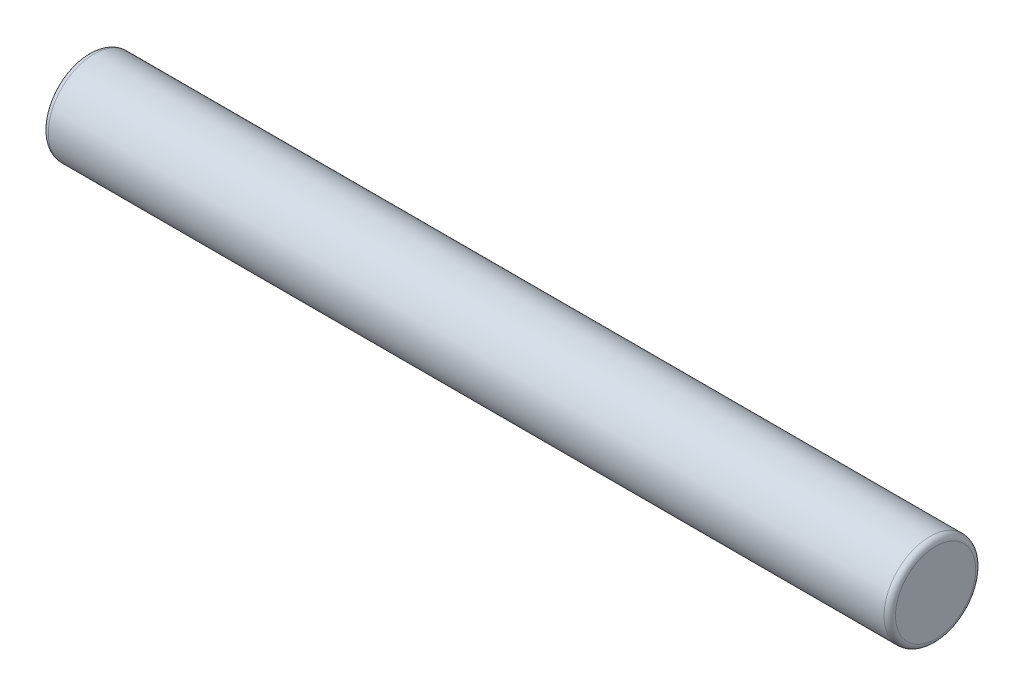
ISO-10303-21;
HEADER;
FILE_DESCRIPTION(('STEP AP214'),'2;1');
FILE_NAME('part.step','',(''),(''),'','','');
FILE_SCHEMA(('AUTOMOTIVE_DESIGN { 1 0 10303 214 1 1 1 1 }'));
ENDSEC;
DATA;
#1=APPLICATION_CONTEXT('core data for automotive mechanical design processes');
#2=APPLICATION_PROTOCOL_DEFINITION('international standard','automotive_design',2000,#1);
#3=PRODUCT_CONTEXT('',#1,'mechanical');
#4=PRODUCT('Part','Part','',(#3));
#5=PRODUCT_RELATED_PRODUCT_CATEGORY('part','',(#4));
#6=PRODUCT_DEFINITION_FORMATION('','',#4);
#7=PRODUCT_DEFINITION_CONTEXT('part definition',#1,'design');
#8=PRODUCT_DEFINITION('design','',#6,#7);
#9=PRODUCT_DEFINITION_SHAPE('','',#8);
#10=(LENGTH_UNIT() NAMED_UNIT(*) SI_UNIT(.MILLI.,.METRE.));
#11=(NAMED_UNIT(*) PLANE_ANGLE_UNIT() SI_UNIT($,.RADIAN.));
#12=(NAMED_UNIT(*) SI_UNIT($,.STERADIAN.) SOLID_ANGLE_UNIT());
#13=UNCERTAINTY_MEASURE_WITH_UNIT(LENGTH_MEASURE(1.E-05),#10,'distance_accuracy_value','');
#14=(GEOMETRIC_REPRESENTATION_CONTEXT(3) GLOBAL_UNCERTAINTY_ASSIGNED_CONTEXT((#13)) GLOBAL_UNIT_ASSIGNED_CONTEXT((#10,
#11,#12)) REPRESENTATION_CONTEXT('',''));
#15=CARTESIAN_POINT('',(0.,0.,0.));
#16=DIRECTION('',(0.,0.,1.));
#17=DIRECTION('',(1.,0.,0.));
#18=AXIS2_PLACEMENT_3D('',#15,#16,#17);
#19=CARTESIAN_POINT('',(18.796,0.,0.));
#20=DIRECTION('',(-1.,0.,0.));
#21=DIRECTION('',(0.,0.,1.));
#22=AXIS2_PLACEMENT_3D('',#19,#20,#21);
#23=CYLINDRICAL_SURFACE('',#22,1.016);
#24=CARTESIAN_POINT('',(0.126999999999999,0.,0.));
#25=DIRECTION('',(1.,0.,0.));
#26=DIRECTION('',(0.,0.,-1.));
#27=AXIS2_PLACEMENT_3D('',#24,#25,#26);
#28=CIRCLE('',#27,1.016);
#29=CARTESIAN_POINT('',(0.126999999999999,0.,-1.016));
#30=VERTEX_POINT('',#29);
#31=EDGE_CURVE('E45',#30,#30,#28,.T.);
#32=ORIENTED_EDGE('',*,*,#31,.T.);
#33=EDGE_LOOP('',(#32));
#34=FACE_BOUND('',#33,.T.);
#35=CARTESIAN_POINT('',(18.669,0.,0.));
#36=DIRECTION('',(1.,0.,0.));
#37=DIRECTION('',(0.,0.,-1.));
#38=AXIS2_PLACEMENT_3D('',#35,#36,#37);
#39=CIRCLE('',#38,1.016);
#40=CARTESIAN_POINT('',(18.669,0.,-1.016));
#41=VERTEX_POINT('',#40);
#42=EDGE_CURVE('E49',#41,#41,#39,.F.);
#43=ORIENTED_EDGE('',*,*,#42,.T.);
#44=EDGE_LOOP('',(#43));
#45=FACE_BOUND('',#44,.T.);
#46=ADVANCED_FACE('F34',(#34,#45),#23,.T.);
#47=CARTESIAN_POINT('',(18.796,0.,0.));
#48=DIRECTION('',(1.,0.,0.));
#49=DIRECTION('',(0.,0.,-1.));
#50=AXIS2_PLACEMENT_3D('',#47,#48,#49);
#51=PLANE('',#50);
#52=CARTESIAN_POINT('',(18.796,0.,0.));
#53=DIRECTION('',(1.,0.,0.));
#54=DIRECTION('',(0.,0.,-1.));
#55=AXIS2_PLACEMENT_3D('',#52,#53,#54);
#56=CIRCLE('',#55,0.889);
#57=CARTESIAN_POINT('',(18.796,0.,-0.889));
#58=VERTEX_POINT('',#57);
#59=EDGE_CURVE('E10',#58,#58,#56,.T.);
#60=ORIENTED_EDGE('',*,*,#59,.T.);
#61=EDGE_LOOP('',(#60));
#62=FACE_BOUND('',#61,.T.);
#63=ADVANCED_FACE('F65',(#62),#51,.T.);
#64=CARTESIAN_POINT('',(0.,0.,0.));
#65=DIRECTION('',(1.,0.,0.));
#66=DIRECTION('',(0.,0.,-1.));
#67=AXIS2_PLACEMENT_3D('',#64,#65,#66);
#68=PLANE('',#67);
#69=CARTESIAN_POINT('',(0.,0.,0.));
#70=DIRECTION('',(1.,0.,0.));
#71=DIRECTION('',(0.,0.,-1.));
#72=AXIS2_PLACEMENT_3D('',#69,#70,#71);
#73=CIRCLE('',#72,0.889);
#74=CARTESIAN_POINT('',(0.,0.,-0.889));
#75=VERTEX_POINT('',#74);
#76=EDGE_CURVE('E41',#75,#75,#73,.F.);
#77=ORIENTED_EDGE('',*,*,#76,.T.);
#78=EDGE_LOOP('',(#77));
#79=FACE_BOUND('',#78,.T.);
#80=ADVANCED_FACE('F62',(#79),#68,.F.);
#81=CARTESIAN_POINT('',(0.126999999999999,0.,0.));
#82=DIRECTION('',(1.,0.,0.));
#83=DIRECTION('',(0.,0.,-1.));
#84=AXIS2_PLACEMENT_3D('',#81,#82,#83);
#85=TOROIDAL_SURFACE('',#84,0.889,0.127);
#86=ORIENTED_EDGE('',*,*,#76,.F.);
#87=EDGE_LOOP('',(#86));
#88=FACE_BOUND('',#87,.T.);
#89=ORIENTED_EDGE('',*,*,#31,.F.);
#90=EDGE_LOOP('',(#89));
#91=FACE_BOUND('',#90,.T.);
#92=ADVANCED_FACE('F58',(#88,#91),#85,.T.);
#93=CARTESIAN_POINT('',(18.669,0.,0.));
#94=DIRECTION('',(1.,0.,0.));
#95=DIRECTION('',(0.,0.,-1.));
#96=AXIS2_PLACEMENT_3D('',#93,#94,#95);
#97=TOROIDAL_SURFACE('',#96,0.889,0.127);
#98=ORIENTED_EDGE('',*,*,#42,.F.);
#99=EDGE_LOOP('',(#98));
#100=FACE_BOUND('',#99,.T.);
#101=ORIENTED_EDGE('',*,*,#59,.F.);
#102=EDGE_LOOP('',(#101));
#103=FACE_BOUND('',#102,.T.);
#104=ADVANCED_FACE('F36',(#100,#103),#97,.T.);
#105=CLOSED_SHELL('',(#46,#63,#80,#92,#104));
#106=MANIFOLD_SOLID_BREP('B2',#105);
#107=ADVANCED_BREP_SHAPE_REPRESENTATION('',(#18,#106),#14);
#108=SHAPE_DEFINITION_REPRESENTATION(#9,#107);
ENDSEC;
END-ISO-10303-21;
